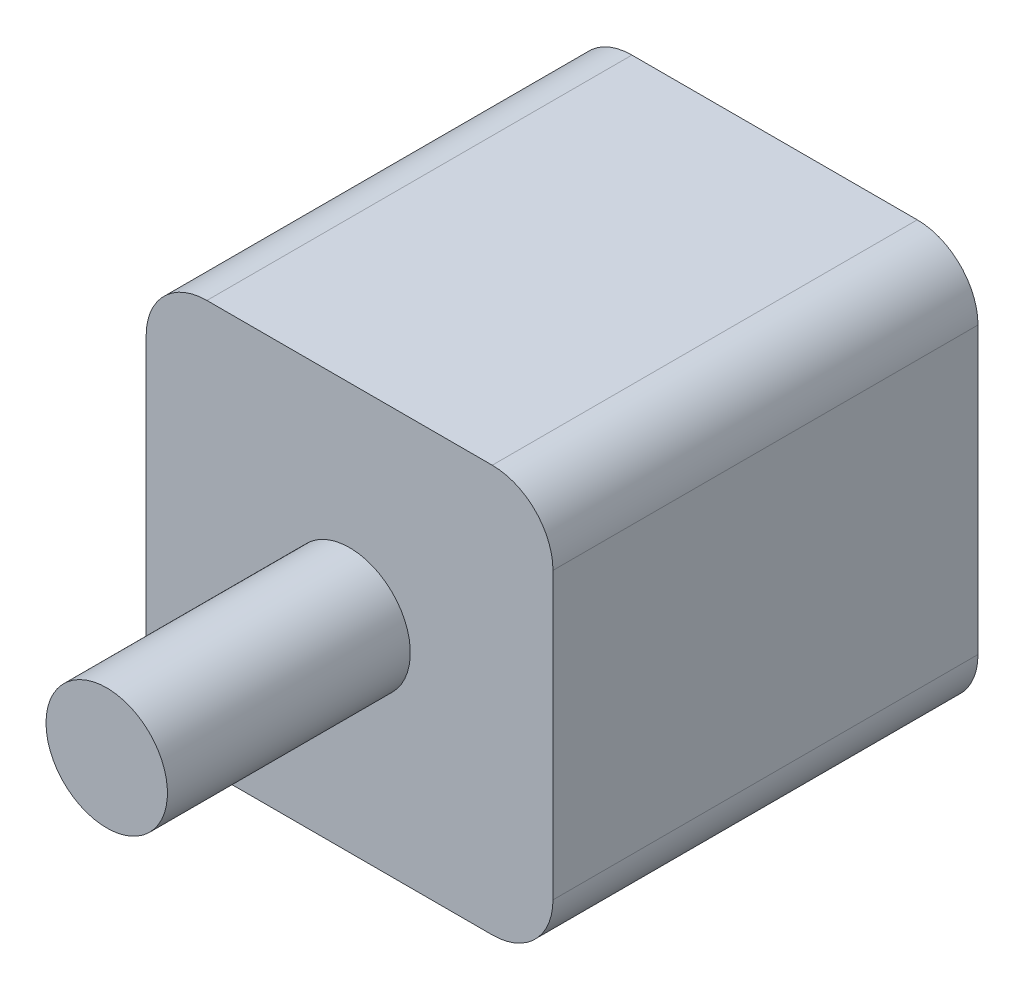
ISO-10303-21;
HEADER;
FILE_DESCRIPTION(('STEP AP214'),'2;1');
FILE_NAME('part.step','',(''),(''),'','','');
FILE_SCHEMA(('AUTOMOTIVE_DESIGN { 1 0 10303 214 1 1 1 1 }'));
ENDSEC;
DATA;
#1=APPLICATION_CONTEXT('core data for automotive mechanical design processes');
#2=APPLICATION_PROTOCOL_DEFINITION('international standard','automotive_design',2000,#1);
#3=PRODUCT_CONTEXT('',#1,'mechanical');
#4=PRODUCT('Part','Part','',(#3));
#5=PRODUCT_RELATED_PRODUCT_CATEGORY('part','',(#4));
#6=PRODUCT_DEFINITION_FORMATION('','',#4);
#7=PRODUCT_DEFINITION_CONTEXT('part definition',#1,'design');
#8=PRODUCT_DEFINITION('design','',#6,#7);
#9=PRODUCT_DEFINITION_SHAPE('','',#8);
#10=(LENGTH_UNIT() NAMED_UNIT(*) SI_UNIT(.MILLI.,.METRE.));
#11=(NAMED_UNIT(*) PLANE_ANGLE_UNIT() SI_UNIT($,.RADIAN.));
#12=(NAMED_UNIT(*) SI_UNIT($,.STERADIAN.) SOLID_ANGLE_UNIT());
#13=UNCERTAINTY_MEASURE_WITH_UNIT(LENGTH_MEASURE(1.E-05),#10,'distance_accuracy_value','');
#14=(GEOMETRIC_REPRESENTATION_CONTEXT(3) GLOBAL_UNCERTAINTY_ASSIGNED_CONTEXT((#13)) GLOBAL_UNIT_ASSIGNED_CONTEXT((#10,
#11,#12)) REPRESENTATION_CONTEXT('',''));
#15=CARTESIAN_POINT('',(0.,0.,0.));
#16=DIRECTION('',(0.,0.,1.));
#17=DIRECTION('',(1.,0.,0.));
#18=AXIS2_PLACEMENT_3D('',#15,#16,#17);
#19=CARTESIAN_POINT('',(0.,0.,44.45));
#20=DIRECTION('',(1.,0.,0.));
#21=DIRECTION('',(0.,0.,-1.));
#22=AXIS2_PLACEMENT_3D('',#19,#20,#21);
#23=PLANE('',#22);
#24=DIRECTION('',(0.,-1.,0.));
#25=VECTOR('',#24,1.);
#26=CARTESIAN_POINT('',(0.,0.,0.));
#27=LINE('',#26,#25);
#28=CARTESIAN_POINT('',(0.,36.195,0.));
#29=VERTEX_POINT('',#28);
#30=CARTESIAN_POINT('',(0.,6.35,0.));
#31=VERTEX_POINT('',#30);
#32=EDGE_CURVE('E125',#29,#31,#27,.T.);
#33=ORIENTED_EDGE('',*,*,#32,.T.);
#34=DIRECTION('',(0.,0.,-1.));
#35=VECTOR('',#34,1.);
#36=CARTESIAN_POINT('',(0.,6.35,44.45));
#37=LINE('',#36,#35);
#38=CARTESIAN_POINT('',(0.,6.35,44.45));
#39=VERTEX_POINT('',#38);
#40=EDGE_CURVE('E103',#31,#39,#37,.F.);
#41=ORIENTED_EDGE('',*,*,#40,.T.);
#42=DIRECTION('',(0.,-1.,0.));
#43=VECTOR('',#42,1.);
#44=CARTESIAN_POINT('',(0.,0.,44.45));
#45=LINE('',#44,#43);
#46=CARTESIAN_POINT('',(0.,36.195,44.45));
#47=VERTEX_POINT('',#46);
#48=EDGE_CURVE('E135',#47,#39,#45,.T.);
#49=ORIENTED_EDGE('',*,*,#48,.F.);
#50=DIRECTION('',(0.,0.,-1.));
#51=VECTOR('',#50,1.);
#52=CARTESIAN_POINT('',(0.,36.195,44.45));
#53=LINE('',#52,#51);
#54=EDGE_CURVE('E108',#47,#29,#53,.T.);
#55=ORIENTED_EDGE('',*,*,#54,.T.);
#56=EDGE_LOOP('',(#33,#41,#49,#55));
#57=FACE_BOUND('',#56,.T.);
#58=ADVANCED_FACE('F32',(#57),#23,.F.);
#59=CARTESIAN_POINT('',(0.,0.,44.45));
#60=DIRECTION('',(0.,1.,0.));
#61=DIRECTION('',(0.,0.,1.));
#62=AXIS2_PLACEMENT_3D('',#59,#60,#61);
#63=PLANE('',#62);
#64=DIRECTION('',(1.,0.,0.));
#65=VECTOR('',#64,1.);
#66=CARTESIAN_POINT('',(0.,0.,44.45));
#67=LINE('',#66,#65);
#68=CARTESIAN_POINT('',(6.35,0.,44.45));
#69=VERTEX_POINT('',#68);
#70=CARTESIAN_POINT('',(36.195,0.,44.45));
#71=VERTEX_POINT('',#70);
#72=EDGE_CURVE('E118',#69,#71,#67,.T.);
#73=ORIENTED_EDGE('',*,*,#72,.F.);
#74=DIRECTION('',(0.,0.,-1.));
#75=VECTOR('',#74,1.);
#76=CARTESIAN_POINT('',(6.35,0.,44.45));
#77=LINE('',#76,#75);
#78=CARTESIAN_POINT('',(6.35,0.,0.));
#79=VERTEX_POINT('',#78);
#80=EDGE_CURVE('E102',#69,#79,#77,.T.);
#81=ORIENTED_EDGE('',*,*,#80,.T.);
#82=DIRECTION('',(1.,0.,0.));
#83=VECTOR('',#82,1.);
#84=CARTESIAN_POINT('',(0.,0.,0.));
#85=LINE('',#84,#83);
#86=CARTESIAN_POINT('',(36.195,0.,0.));
#87=VERTEX_POINT('',#86);
#88=EDGE_CURVE('E115',#79,#87,#85,.T.);
#89=ORIENTED_EDGE('',*,*,#88,.T.);
#90=DIRECTION('',(0.,0.,-1.));
#91=VECTOR('',#90,1.);
#92=CARTESIAN_POINT('',(36.195,0.,44.45));
#93=LINE('',#92,#91);
#94=EDGE_CURVE('E120',#87,#71,#93,.F.);
#95=ORIENTED_EDGE('',*,*,#94,.T.);
#96=EDGE_LOOP('',(#73,#81,#89,#95));
#97=FACE_BOUND('',#96,.T.);
#98=ADVANCED_FACE('F114',(#97),#63,.F.);
#99=CARTESIAN_POINT('',(42.545,0.,44.45));
#100=DIRECTION('',(-1.,0.,0.));
#101=DIRECTION('',(0.,0.,1.));
#102=AXIS2_PLACEMENT_3D('',#99,#100,#101);
#103=PLANE('',#102);
#104=DIRECTION('',(0.,1.,0.));
#105=VECTOR('',#104,1.);
#106=CARTESIAN_POINT('',(42.545,0.,44.45));
#107=LINE('',#106,#105);
#108=CARTESIAN_POINT('',(42.545,6.35,44.45));
#109=VERTEX_POINT('',#108);
#110=CARTESIAN_POINT('',(42.545,36.195,44.45));
#111=VERTEX_POINT('',#110);
#112=EDGE_CURVE('E161',#109,#111,#107,.T.);
#113=ORIENTED_EDGE('',*,*,#112,.F.);
#114=DIRECTION('',(0.,0.,-1.));
#115=VECTOR('',#114,1.);
#116=CARTESIAN_POINT('',(42.545,6.35,44.45));
#117=LINE('',#116,#115);
#118=CARTESIAN_POINT('',(42.545,6.35,0.));
#119=VERTEX_POINT('',#118);
#120=EDGE_CURVE('E154',#109,#119,#117,.T.);
#121=ORIENTED_EDGE('',*,*,#120,.T.);
#122=DIRECTION('',(0.,1.,0.));
#123=VECTOR('',#122,1.);
#124=CARTESIAN_POINT('',(42.545,0.,0.));
#125=LINE('',#124,#123);
#126=CARTESIAN_POINT('',(42.545,36.195,0.));
#127=VERTEX_POINT('',#126);
#128=EDGE_CURVE('E124',#119,#127,#125,.T.);
#129=ORIENTED_EDGE('',*,*,#128,.T.);
#130=DIRECTION('',(0.,0.,-1.));
#131=VECTOR('',#130,1.);
#132=CARTESIAN_POINT('',(42.545,36.195,44.45));
#133=LINE('',#132,#131);
#134=EDGE_CURVE('E152',#127,#111,#133,.F.);
#135=ORIENTED_EDGE('',*,*,#134,.T.);
#136=EDGE_LOOP('',(#113,#121,#129,#135));
#137=FACE_BOUND('',#136,.T.);
#138=ADVANCED_FACE('F159',(#137),#103,.F.);
#139=CARTESIAN_POINT('',(0.,42.545,44.45));
#140=DIRECTION('',(0.,-1.,0.));
#141=DIRECTION('',(0.,0.,-1.));
#142=AXIS2_PLACEMENT_3D('',#139,#140,#141);
#143=PLANE('',#142);
#144=DIRECTION('',(-1.,0.,0.));
#145=VECTOR('',#144,1.);
#146=CARTESIAN_POINT('',(0.,42.545,44.45));
#147=LINE('',#146,#145);
#148=CARTESIAN_POINT('',(36.195,42.545,44.45));
#149=VERTEX_POINT('',#148);
#150=CARTESIAN_POINT('',(6.35,42.545,44.45));
#151=VERTEX_POINT('',#150);
#152=EDGE_CURVE('E136',#149,#151,#147,.T.);
#153=ORIENTED_EDGE('',*,*,#152,.F.);
#154=DIRECTION('',(0.,0.,-1.));
#155=VECTOR('',#154,1.);
#156=CARTESIAN_POINT('',(36.195,42.545,44.45));
#157=LINE('',#156,#155);
#158=CARTESIAN_POINT('',(36.195,42.545,0.));
#159=VERTEX_POINT('',#158);
#160=EDGE_CURVE('E11',#149,#159,#157,.T.);
#161=ORIENTED_EDGE('',*,*,#160,.T.);
#162=DIRECTION('',(-1.,0.,0.));
#163=VECTOR('',#162,1.);
#164=CARTESIAN_POINT('',(0.,42.545,0.));
#165=LINE('',#164,#163);
#166=CARTESIAN_POINT('',(6.35,42.545,0.));
#167=VERTEX_POINT('',#166);
#168=EDGE_CURVE('E128',#159,#167,#165,.T.);
#169=ORIENTED_EDGE('',*,*,#168,.T.);
#170=DIRECTION('',(0.,0.,-1.));
#171=VECTOR('',#170,1.);
#172=CARTESIAN_POINT('',(6.35,42.545,44.45));
#173=LINE('',#172,#171);
#174=EDGE_CURVE('E40',#167,#151,#173,.F.);
#175=ORIENTED_EDGE('',*,*,#174,.T.);
#176=EDGE_LOOP('',(#153,#161,#169,#175));
#177=FACE_BOUND('',#176,.T.);
#178=ADVANCED_FACE('F168',(#177),#143,.F.);
#179=CARTESIAN_POINT('',(0.,0.,44.45));
#180=DIRECTION('',(0.,0.,-1.));
#181=DIRECTION('',(-1.,0.,0.));
#182=AXIS2_PLACEMENT_3D('',#179,#180,#181);
#183=PLANE('',#182);
#184=CARTESIAN_POINT('',(21.2725,21.2725,44.45));
#185=DIRECTION('',(0.,0.,-1.));
#186=DIRECTION('',(-1.,0.,0.));
#187=AXIS2_PLACEMENT_3D('',#184,#185,#186);
#188=CIRCLE('',#187,6.35);
#189=CARTESIAN_POINT('',(14.9225,21.2725,44.45));
#190=VERTEX_POINT('',#189);
#191=EDGE_CURVE('E130',#190,#190,#188,.T.);
#192=ORIENTED_EDGE('',*,*,#191,.T.);
#193=EDGE_LOOP('',(#192));
#194=FACE_BOUND('',#193,.T.);
#195=ORIENTED_EDGE('',*,*,#48,.T.);
#196=CARTESIAN_POINT('',(6.35,6.35,44.45));
#197=DIRECTION('',(0.,0.,-1.));
#198=DIRECTION('',(-1.,0.,0.));
#199=AXIS2_PLACEMENT_3D('',#196,#197,#198);
#200=CIRCLE('',#199,6.35);
#201=EDGE_CURVE('E150',#39,#69,#200,.F.);
#202=ORIENTED_EDGE('',*,*,#201,.T.);
#203=ORIENTED_EDGE('',*,*,#72,.T.);
#204=CARTESIAN_POINT('',(36.195,6.35,44.45));
#205=DIRECTION('',(0.,0.,-1.));
#206=DIRECTION('',(-1.,0.,0.));
#207=AXIS2_PLACEMENT_3D('',#204,#205,#206);
#208=CIRCLE('',#207,6.35);
#209=EDGE_CURVE('E148',#71,#109,#208,.F.);
#210=ORIENTED_EDGE('',*,*,#209,.T.);
#211=ORIENTED_EDGE('',*,*,#112,.T.);
#212=CARTESIAN_POINT('',(36.195,36.195,44.45));
#213=DIRECTION('',(0.,0.,-1.));
#214=DIRECTION('',(-1.,0.,0.));
#215=AXIS2_PLACEMENT_3D('',#212,#213,#214);
#216=CIRCLE('',#215,6.35);
#217=EDGE_CURVE('E53',#111,#149,#216,.F.);
#218=ORIENTED_EDGE('',*,*,#217,.T.);
#219=ORIENTED_EDGE('',*,*,#152,.T.);
#220=CARTESIAN_POINT('',(6.35,36.195,44.45));
#221=DIRECTION('',(0.,0.,-1.));
#222=DIRECTION('',(-1.,0.,0.));
#223=AXIS2_PLACEMENT_3D('',#220,#221,#222);
#224=CIRCLE('',#223,6.35);
#225=EDGE_CURVE('E145',#151,#47,#224,.F.);
#226=ORIENTED_EDGE('',*,*,#225,.T.);
#227=EDGE_LOOP('',(#195,#202,#203,#210,#211,#218,#219,#226));
#228=FACE_BOUND('',#227,.T.);
#229=ADVANCED_FACE('F213',(#194,#228),#183,.F.);
#230=CARTESIAN_POINT('',(0.,0.,0.));
#231=DIRECTION('',(0.,0.,-1.));
#232=DIRECTION('',(-1.,0.,0.));
#233=AXIS2_PLACEMENT_3D('',#230,#231,#232);
#234=PLANE('',#233);
#235=ORIENTED_EDGE('',*,*,#88,.F.);
#236=CARTESIAN_POINT('',(6.35,6.35,0.));
#237=DIRECTION('',(0.,0.,-1.));
#238=DIRECTION('',(-1.,0.,0.));
#239=AXIS2_PLACEMENT_3D('',#236,#237,#238);
#240=CIRCLE('',#239,6.35);
#241=EDGE_CURVE('E98',#79,#31,#240,.T.);
#242=ORIENTED_EDGE('',*,*,#241,.T.);
#243=ORIENTED_EDGE('',*,*,#32,.F.);
#244=CARTESIAN_POINT('',(6.35,36.195,0.));
#245=DIRECTION('',(0.,0.,-1.));
#246=DIRECTION('',(-1.,0.,0.));
#247=AXIS2_PLACEMENT_3D('',#244,#245,#246);
#248=CIRCLE('',#247,6.35);
#249=EDGE_CURVE('E119',#29,#167,#248,.T.);
#250=ORIENTED_EDGE('',*,*,#249,.T.);
#251=ORIENTED_EDGE('',*,*,#168,.F.);
#252=CARTESIAN_POINT('',(36.195,36.195,0.));
#253=DIRECTION('',(0.,0.,-1.));
#254=DIRECTION('',(-1.,0.,0.));
#255=AXIS2_PLACEMENT_3D('',#252,#253,#254);
#256=CIRCLE('',#255,6.35);
#257=EDGE_CURVE('E139',#159,#127,#256,.T.);
#258=ORIENTED_EDGE('',*,*,#257,.T.);
#259=ORIENTED_EDGE('',*,*,#128,.F.);
#260=CARTESIAN_POINT('',(36.195,6.35,0.));
#261=DIRECTION('',(0.,0.,-1.));
#262=DIRECTION('',(-1.,0.,0.));
#263=AXIS2_PLACEMENT_3D('',#260,#261,#262);
#264=CIRCLE('',#263,6.35);
#265=EDGE_CURVE('E109',#119,#87,#264,.T.);
#266=ORIENTED_EDGE('',*,*,#265,.T.);
#267=EDGE_LOOP('',(#235,#242,#243,#250,#251,#258,#259,#266));
#268=FACE_BOUND('',#267,.T.);
#269=ADVANCED_FACE('F122',(#268),#234,.T.);
#270=CARTESIAN_POINT('',(6.35,6.35,44.45));
#271=DIRECTION('',(0.,0.,-1.));
#272=DIRECTION('',(-1.,0.,0.));
#273=AXIS2_PLACEMENT_3D('',#270,#271,#272);
#274=CYLINDRICAL_SURFACE('',#273,6.35);
#275=ORIENTED_EDGE('',*,*,#201,.F.);
#276=ORIENTED_EDGE('',*,*,#40,.F.);
#277=ORIENTED_EDGE('',*,*,#241,.F.);
#278=ORIENTED_EDGE('',*,*,#80,.F.);
#279=EDGE_LOOP('',(#275,#276,#277,#278));
#280=FACE_BOUND('',#279,.T.);
#281=ADVANCED_FACE('F101',(#280),#274,.T.);
#282=CARTESIAN_POINT('',(36.195,6.35,44.45));
#283=DIRECTION('',(0.,0.,-1.));
#284=DIRECTION('',(-1.,0.,0.));
#285=AXIS2_PLACEMENT_3D('',#282,#283,#284);
#286=CYLINDRICAL_SURFACE('',#285,6.35);
#287=ORIENTED_EDGE('',*,*,#209,.F.);
#288=ORIENTED_EDGE('',*,*,#94,.F.);
#289=ORIENTED_EDGE('',*,*,#265,.F.);
#290=ORIENTED_EDGE('',*,*,#120,.F.);
#291=EDGE_LOOP('',(#287,#288,#289,#290));
#292=FACE_BOUND('',#291,.T.);
#293=ADVANCED_FACE('F202',(#292),#286,.T.);
#294=CARTESIAN_POINT('',(36.195,36.195,44.45));
#295=DIRECTION('',(0.,0.,-1.));
#296=DIRECTION('',(-1.,0.,0.));
#297=AXIS2_PLACEMENT_3D('',#294,#295,#296);
#298=CYLINDRICAL_SURFACE('',#297,6.35);
#299=ORIENTED_EDGE('',*,*,#217,.F.);
#300=ORIENTED_EDGE('',*,*,#134,.F.);
#301=ORIENTED_EDGE('',*,*,#257,.F.);
#302=ORIENTED_EDGE('',*,*,#160,.F.);
#303=EDGE_LOOP('',(#299,#300,#301,#302));
#304=FACE_BOUND('',#303,.T.);
#305=ADVANCED_FACE('F167',(#304),#298,.T.);
#306=CARTESIAN_POINT('',(6.35,36.195,44.45));
#307=DIRECTION('',(0.,0.,-1.));
#308=DIRECTION('',(-1.,0.,0.));
#309=AXIS2_PLACEMENT_3D('',#306,#307,#308);
#310=CYLINDRICAL_SURFACE('',#309,6.35);
#311=ORIENTED_EDGE('',*,*,#225,.F.);
#312=ORIENTED_EDGE('',*,*,#174,.F.);
#313=ORIENTED_EDGE('',*,*,#249,.F.);
#314=ORIENTED_EDGE('',*,*,#54,.F.);
#315=EDGE_LOOP('',(#311,#312,#313,#314));
#316=FACE_BOUND('',#315,.T.);
#317=ADVANCED_FACE('F34',(#316),#310,.T.);
#318=CARTESIAN_POINT('',(21.2725,21.2725,69.85));
#319=DIRECTION('',(0.,0.,-1.));
#320=DIRECTION('',(-1.,0.,0.));
#321=AXIS2_PLACEMENT_3D('',#318,#319,#320);
#322=CYLINDRICAL_SURFACE('',#321,6.35);
#323=CARTESIAN_POINT('',(21.2725,21.2725,69.85));
#324=DIRECTION('',(0.,0.,-1.));
#325=DIRECTION('',(-1.,0.,0.));
#326=AXIS2_PLACEMENT_3D('',#323,#324,#325);
#327=CIRCLE('',#326,6.35);
#328=CARTESIAN_POINT('',(14.9225,21.2725,69.85));
#329=VERTEX_POINT('',#328);
#330=EDGE_CURVE('E177',#329,#329,#327,.T.);
#331=ORIENTED_EDGE('',*,*,#330,.T.);
#332=EDGE_LOOP('',(#331));
#333=FACE_BOUND('',#332,.T.);
#334=ORIENTED_EDGE('',*,*,#191,.F.);
#335=EDGE_LOOP('',(#334));
#336=FACE_BOUND('',#335,.T.);
#337=ADVANCED_FACE('F181',(#333,#336),#322,.T.);
#338=CARTESIAN_POINT('',(21.2725,21.2725,69.85));
#339=DIRECTION('',(0.,0.,-1.));
#340=DIRECTION('',(-1.,0.,0.));
#341=AXIS2_PLACEMENT_3D('',#338,#339,#340);
#342=PLANE('',#341);
#343=ORIENTED_EDGE('',*,*,#330,.F.);
#344=EDGE_LOOP('',(#343));
#345=FACE_BOUND('',#344,.T.);
#346=ADVANCED_FACE('F184',(#345),#342,.F.);
#347=CLOSED_SHELL('',(#58,#98,#138,#178,#229,#269,#281,#293,#305,#317,#337,#346));
#348=MANIFOLD_SOLID_BREP('B2',#347);
#349=ADVANCED_BREP_SHAPE_REPRESENTATION('',(#18,#348),#14);
#350=SHAPE_DEFINITION_REPRESENTATION(#9,#349);
ENDSEC;
END-ISO-10303-21;
